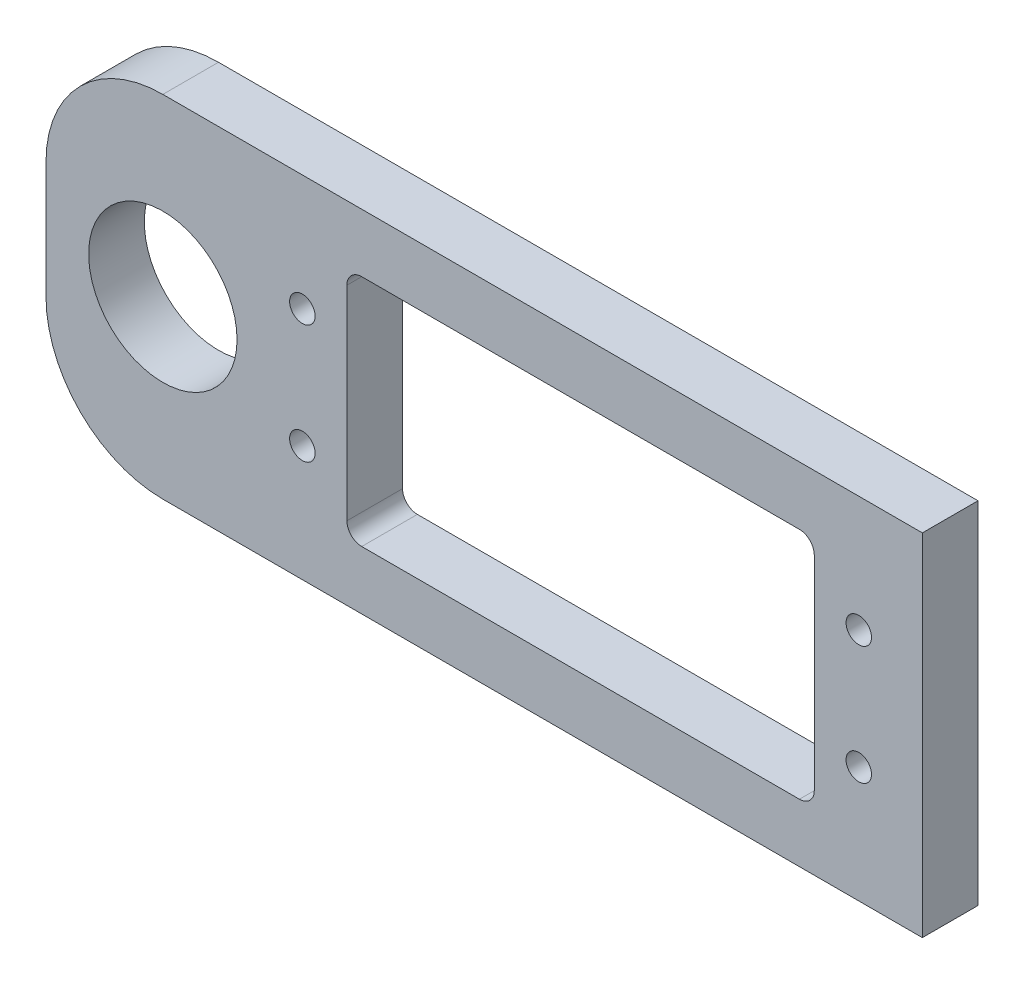
ISO-10303-21;
HEADER;
FILE_DESCRIPTION(('STEP AP214'),'2;1');
FILE_NAME('part.step','',(''),(''),'','','');
FILE_SCHEMA(('AUTOMOTIVE_DESIGN { 1 0 10303 214 1 1 1 1 }'));
ENDSEC;
DATA;
#1=APPLICATION_CONTEXT('core data for automotive mechanical design processes');
#2=APPLICATION_PROTOCOL_DEFINITION('international standard','automotive_design',2000,#1);
#3=PRODUCT_CONTEXT('',#1,'mechanical');
#4=PRODUCT('Part','Part','',(#3));
#5=PRODUCT_RELATED_PRODUCT_CATEGORY('part','',(#4));
#6=PRODUCT_DEFINITION_FORMATION('','',#4);
#7=PRODUCT_DEFINITION_CONTEXT('part definition',#1,'design');
#8=PRODUCT_DEFINITION('design','',#6,#7);
#9=PRODUCT_DEFINITION_SHAPE('','',#8);
#10=(LENGTH_UNIT() NAMED_UNIT(*) SI_UNIT(.MILLI.,.METRE.));
#11=(NAMED_UNIT(*) PLANE_ANGLE_UNIT() SI_UNIT($,.RADIAN.));
#12=(NAMED_UNIT(*) SI_UNIT($,.STERADIAN.) SOLID_ANGLE_UNIT());
#13=UNCERTAINTY_MEASURE_WITH_UNIT(LENGTH_MEASURE(1.E-05),#10,'distance_accuracy_value','');
#14=(GEOMETRIC_REPRESENTATION_CONTEXT(3) GLOBAL_UNCERTAINTY_ASSIGNED_CONTEXT((#13)) GLOBAL_UNIT_ASSIGNED_CONTEXT((#10,
#11,#12)) REPRESENTATION_CONTEXT('',''));
#15=CARTESIAN_POINT('',(0.,0.,0.));
#16=DIRECTION('',(0.,0.,1.));
#17=DIRECTION('',(1.,0.,0.));
#18=AXIS2_PLACEMENT_3D('',#15,#16,#17);
#19=CARTESIAN_POINT('',(37.5,15.,4.7625));
#20=DIRECTION('',(-1.,0.,0.));
#21=DIRECTION('',(0.,-1.,0.));
#22=AXIS2_PLACEMENT_3D('',#19,#20,#21);
#23=PLANE('',#22);
#24=DIRECTION('',(0.,1.,0.));
#25=VECTOR('',#24,1.);
#26=CARTESIAN_POINT('',(37.5,15.,0.));
#27=LINE('',#26,#25);
#28=CARTESIAN_POINT('',(37.5,-15.,0.));
#29=VERTEX_POINT('',#28);
#30=CARTESIAN_POINT('',(37.5,15.,0.));
#31=VERTEX_POINT('',#30);
#32=EDGE_CURVE('E159',#29,#31,#27,.T.);
#33=ORIENTED_EDGE('',*,*,#32,.T.);
#34=DIRECTION('',(0.,0.,-1.));
#35=VECTOR('',#34,1.);
#36=CARTESIAN_POINT('',(37.5,15.,4.7625));
#37=LINE('',#36,#35);
#38=CARTESIAN_POINT('',(37.5,15.,4.7625));
#39=VERTEX_POINT('',#38);
#40=EDGE_CURVE('E139',#39,#31,#37,.T.);
#41=ORIENTED_EDGE('',*,*,#40,.F.);
#42=DIRECTION('',(0.,1.,0.));
#43=VECTOR('',#42,1.);
#44=CARTESIAN_POINT('',(37.5,15.,4.7625));
#45=LINE('',#44,#43);
#46=CARTESIAN_POINT('',(37.5,-15.,4.7625));
#47=VERTEX_POINT('',#46);
#48=EDGE_CURVE('E146',#47,#39,#45,.T.);
#49=ORIENTED_EDGE('',*,*,#48,.F.);
#50=DIRECTION('',(0.,0.,-1.));
#51=VECTOR('',#50,1.);
#52=CARTESIAN_POINT('',(37.5,-15.,4.7625));
#53=LINE('',#52,#51);
#54=EDGE_CURVE('E161',#47,#29,#53,.T.);
#55=ORIENTED_EDGE('',*,*,#54,.T.);
#56=EDGE_LOOP('',(#33,#41,#49,#55));
#57=FACE_BOUND('',#56,.T.);
#58=ADVANCED_FACE('F33',(#57),#23,.F.);
#59=CARTESIAN_POINT('',(-37.5,15.,4.7625));
#60=DIRECTION('',(0.,-1.,0.));
#61=DIRECTION('',(0.,0.,-1.));
#62=AXIS2_PLACEMENT_3D('',#59,#60,#61);
#63=PLANE('',#62);
#64=DIRECTION('',(-1.,0.,0.));
#65=VECTOR('',#64,1.);
#66=CARTESIAN_POINT('',(-37.5,15.,0.));
#67=LINE('',#66,#65);
#68=CARTESIAN_POINT('',(-27.5,15.,0.));
#69=VERTEX_POINT('',#68);
#70=EDGE_CURVE('E304',#31,#69,#67,.T.);
#71=ORIENTED_EDGE('',*,*,#70,.T.);
#72=DIRECTION('',(0.,0.,-1.));
#73=VECTOR('',#72,1.);
#74=CARTESIAN_POINT('',(-27.5,15.,4.7625));
#75=LINE('',#74,#73);
#76=CARTESIAN_POINT('',(-27.5,15.,4.7625));
#77=VERTEX_POINT('',#76);
#78=EDGE_CURVE('E142',#69,#77,#75,.F.);
#79=ORIENTED_EDGE('',*,*,#78,.T.);
#80=DIRECTION('',(-1.,0.,0.));
#81=VECTOR('',#80,1.);
#82=CARTESIAN_POINT('',(-37.5,15.,4.7625));
#83=LINE('',#82,#81);
#84=EDGE_CURVE('E134',#39,#77,#83,.T.);
#85=ORIENTED_EDGE('',*,*,#84,.F.);
#86=ORIENTED_EDGE('',*,*,#40,.T.);
#87=EDGE_LOOP('',(#71,#79,#85,#86));
#88=FACE_BOUND('',#87,.T.);
#89=ADVANCED_FACE('F137',(#88),#63,.F.);
#90=CARTESIAN_POINT('',(-37.5,15.,4.7625));
#91=DIRECTION('',(1.,0.,0.));
#92=DIRECTION('',(0.,1.,0.));
#93=AXIS2_PLACEMENT_3D('',#90,#91,#92);
#94=PLANE('',#93);
#95=DIRECTION('',(0.,-1.,0.));
#96=VECTOR('',#95,1.);
#97=CARTESIAN_POINT('',(-37.5,15.,0.));
#98=LINE('',#97,#96);
#99=CARTESIAN_POINT('',(-37.5,5.,0.));
#100=VERTEX_POINT('',#99);
#101=CARTESIAN_POINT('',(-37.5,-5.,0.));
#102=VERTEX_POINT('',#101);
#103=EDGE_CURVE('E306',#100,#102,#98,.T.);
#104=ORIENTED_EDGE('',*,*,#103,.T.);
#105=DIRECTION('',(0.,0.,-1.));
#106=VECTOR('',#105,1.);
#107=CARTESIAN_POINT('',(-37.5,-5.,4.7625));
#108=LINE('',#107,#106);
#109=CARTESIAN_POINT('',(-37.5,-5.,4.7625));
#110=VERTEX_POINT('',#109);
#111=EDGE_CURVE('E175',#102,#110,#108,.F.);
#112=ORIENTED_EDGE('',*,*,#111,.T.);
#113=DIRECTION('',(0.,-1.,0.));
#114=VECTOR('',#113,1.);
#115=CARTESIAN_POINT('',(-37.5,15.,4.7625));
#116=LINE('',#115,#114);
#117=CARTESIAN_POINT('',(-37.5,5.,4.7625));
#118=VERTEX_POINT('',#117);
#119=EDGE_CURVE('E145',#118,#110,#116,.T.);
#120=ORIENTED_EDGE('',*,*,#119,.F.);
#121=DIRECTION('',(0.,0.,-1.));
#122=VECTOR('',#121,1.);
#123=CARTESIAN_POINT('',(-37.5,5.,4.7625));
#124=LINE('',#123,#122);
#125=EDGE_CURVE('E172',#118,#100,#124,.T.);
#126=ORIENTED_EDGE('',*,*,#125,.T.);
#127=EDGE_LOOP('',(#104,#112,#120,#126));
#128=FACE_BOUND('',#127,.T.);
#129=ADVANCED_FACE('F248',(#128),#94,.F.);
#130=CARTESIAN_POINT('',(-37.5,-15.,4.7625));
#131=DIRECTION('',(0.,1.,0.));
#132=DIRECTION('',(0.,0.,1.));
#133=AXIS2_PLACEMENT_3D('',#130,#131,#132);
#134=PLANE('',#133);
#135=DIRECTION('',(1.,0.,0.));
#136=VECTOR('',#135,1.);
#137=CARTESIAN_POINT('',(-37.5,-15.,4.7625));
#138=LINE('',#137,#136);
#139=CARTESIAN_POINT('',(-27.5,-15.,4.7625));
#140=VERTEX_POINT('',#139);
#141=EDGE_CURVE('E152',#140,#47,#138,.T.);
#142=ORIENTED_EDGE('',*,*,#141,.F.);
#143=DIRECTION('',(0.,0.,-1.));
#144=VECTOR('',#143,1.);
#145=CARTESIAN_POINT('',(-27.5,-15.,4.7625));
#146=LINE('',#145,#144);
#147=CARTESIAN_POINT('',(-27.5,-15.,0.));
#148=VERTEX_POINT('',#147);
#149=EDGE_CURVE('E160',#140,#148,#146,.T.);
#150=ORIENTED_EDGE('',*,*,#149,.T.);
#151=DIRECTION('',(1.,0.,0.));
#152=VECTOR('',#151,1.);
#153=CARTESIAN_POINT('',(-37.5,-15.,0.));
#154=LINE('',#153,#152);
#155=EDGE_CURVE('E156',#148,#29,#154,.T.);
#156=ORIENTED_EDGE('',*,*,#155,.T.);
#157=ORIENTED_EDGE('',*,*,#54,.F.);
#158=EDGE_LOOP('',(#142,#150,#156,#157));
#159=FACE_BOUND('',#158,.T.);
#160=ADVANCED_FACE('F310',(#159),#134,.F.);
#161=CARTESIAN_POINT('',(0.,0.,4.7625));
#162=DIRECTION('',(0.,0.,1.));
#163=DIRECTION('',(1.,0.,0.));
#164=AXIS2_PLACEMENT_3D('',#161,#162,#163);
#165=PLANE('',#164);
#166=CARTESIAN_POINT('',(32.06,5.08000000000001,4.7625));
#167=DIRECTION('',(0.,0.,1.));
#168=DIRECTION('',(-1.,0.,0.));
#169=AXIS2_PLACEMENT_3D('',#166,#167,#168);
#170=CIRCLE('',#169,1.09);
#171=CARTESIAN_POINT('',(30.97,5.08000000000001,4.7625));
#172=VERTEX_POINT('',#171);
#173=EDGE_CURVE('E377',#172,#172,#170,.T.);
#174=ORIENTED_EDGE('',*,*,#173,.F.);
#175=EDGE_LOOP('',(#174));
#176=FACE_BOUND('',#175,.T.);
#177=CARTESIAN_POINT('',(32.06,-5.07999999999999,4.7625));
#178=DIRECTION('',(0.,0.,1.));
#179=DIRECTION('',(1.,0.,0.));
#180=AXIS2_PLACEMENT_3D('',#177,#178,#179);
#181=CIRCLE('',#180,1.09);
#182=CARTESIAN_POINT('',(33.15,-5.07999999999999,4.7625));
#183=VERTEX_POINT('',#182);
#184=EDGE_CURVE('E371',#183,#183,#181,.T.);
#185=ORIENTED_EDGE('',*,*,#184,.F.);
#186=EDGE_LOOP('',(#185));
#187=FACE_BOUND('',#186,.T.);
#188=CARTESIAN_POINT('',(-15.56,-5.08,4.7625));
#189=DIRECTION('',(0.,0.,1.));
#190=DIRECTION('',(-1.,0.,0.));
#191=AXIS2_PLACEMENT_3D('',#188,#189,#190);
#192=CIRCLE('',#191,1.09);
#193=CARTESIAN_POINT('',(-16.65,-5.08,4.7625));
#194=VERTEX_POINT('',#193);
#195=EDGE_CURVE('E361',#194,#194,#192,.T.);
#196=ORIENTED_EDGE('',*,*,#195,.F.);
#197=EDGE_LOOP('',(#196));
#198=FACE_BOUND('',#197,.T.);
#199=CARTESIAN_POINT('',(-15.56,5.08,4.7625));
#200=DIRECTION('',(0.,0.,1.));
#201=DIRECTION('',(1.,0.,0.));
#202=AXIS2_PLACEMENT_3D('',#199,#200,#201);
#203=CIRCLE('',#202,1.09);
#204=CARTESIAN_POINT('',(-14.47,5.08,4.7625));
#205=VERTEX_POINT('',#204);
#206=EDGE_CURVE('E282',#205,#205,#203,.T.);
#207=ORIENTED_EDGE('',*,*,#206,.F.);
#208=EDGE_LOOP('',(#207));
#209=FACE_BOUND('',#208,.T.);
#210=DIRECTION('',(0.,-1.,0.));
#211=VECTOR('',#210,1.);
#212=CARTESIAN_POINT('',(-11.75,10.,4.7625));
#213=LINE('',#212,#211);
#214=CARTESIAN_POINT('',(-11.75,8.73,4.7625));
#215=VERTEX_POINT('',#214);
#216=CARTESIAN_POINT('',(-11.75,-8.73,4.7625));
#217=VERTEX_POINT('',#216);
#218=EDGE_CURVE('E288',#215,#217,#213,.T.);
#219=ORIENTED_EDGE('',*,*,#218,.F.);
#220=CARTESIAN_POINT('',(-10.48,8.73,4.7625));
#221=DIRECTION('',(0.,0.,1.));
#222=DIRECTION('',(1.,0.,0.));
#223=AXIS2_PLACEMENT_3D('',#220,#221,#222);
#224=CIRCLE('',#223,1.27);
#225=CARTESIAN_POINT('',(-10.48,10.,4.7625));
#226=VERTEX_POINT('',#225);
#227=EDGE_CURVE('E41',#215,#226,#224,.F.);
#228=ORIENTED_EDGE('',*,*,#227,.T.);
#229=DIRECTION('',(-1.,0.,0.));
#230=VECTOR('',#229,1.);
#231=CARTESIAN_POINT('',(-11.75,10.,4.7625));
#232=LINE('',#231,#230);
#233=CARTESIAN_POINT('',(26.98,10.,4.7625));
#234=VERTEX_POINT('',#233);
#235=EDGE_CURVE('E296',#234,#226,#232,.T.);
#236=ORIENTED_EDGE('',*,*,#235,.F.);
#237=CARTESIAN_POINT('',(26.98,8.73,4.7625));
#238=DIRECTION('',(0.,0.,1.));
#239=DIRECTION('',(1.,0.,0.));
#240=AXIS2_PLACEMENT_3D('',#237,#238,#239);
#241=CIRCLE('',#240,1.27);
#242=CARTESIAN_POINT('',(28.25,8.73,4.7625));
#243=VERTEX_POINT('',#242);
#244=EDGE_CURVE('E55',#234,#243,#241,.F.);
#245=ORIENTED_EDGE('',*,*,#244,.T.);
#246=DIRECTION('',(0.,1.,0.));
#247=VECTOR('',#246,1.);
#248=CARTESIAN_POINT('',(28.25,10.,4.7625));
#249=LINE('',#248,#247);
#250=CARTESIAN_POINT('',(28.25,-8.73,4.7625));
#251=VERTEX_POINT('',#250);
#252=EDGE_CURVE('E294',#251,#243,#249,.T.);
#253=ORIENTED_EDGE('',*,*,#252,.F.);
#254=CARTESIAN_POINT('',(26.98,-8.73,4.7625));
#255=DIRECTION('',(0.,0.,1.));
#256=DIRECTION('',(1.,0.,0.));
#257=AXIS2_PLACEMENT_3D('',#254,#255,#256);
#258=CIRCLE('',#257,1.27);
#259=CARTESIAN_POINT('',(26.98,-10.,4.7625));
#260=VERTEX_POINT('',#259);
#261=EDGE_CURVE('E205',#251,#260,#258,.F.);
#262=ORIENTED_EDGE('',*,*,#261,.T.);
#263=DIRECTION('',(1.,0.,0.));
#264=VECTOR('',#263,1.);
#265=CARTESIAN_POINT('',(-11.75,-10.,4.7625));
#266=LINE('',#265,#264);
#267=CARTESIAN_POINT('',(-10.48,-10.,4.7625));
#268=VERTEX_POINT('',#267);
#269=EDGE_CURVE('E291',#268,#260,#266,.T.);
#270=ORIENTED_EDGE('',*,*,#269,.F.);
#271=CARTESIAN_POINT('',(-10.48,-8.73,4.7625));
#272=DIRECTION('',(0.,0.,1.));
#273=DIRECTION('',(1.,0.,0.));
#274=AXIS2_PLACEMENT_3D('',#271,#272,#273);
#275=CIRCLE('',#274,1.27);
#276=EDGE_CURVE('E209',#268,#217,#275,.F.);
#277=ORIENTED_EDGE('',*,*,#276,.T.);
#278=EDGE_LOOP('',(#219,#228,#236,#245,#253,#262,#270,#277));
#279=FACE_BOUND('',#278,.T.);
#280=CARTESIAN_POINT('',(-27.5,0.,4.7625));
#281=DIRECTION('',(0.,0.,1.));
#282=DIRECTION('',(1.,0.,0.));
#283=AXIS2_PLACEMENT_3D('',#280,#281,#282);
#284=CIRCLE('',#283,6.35);
#285=CARTESIAN_POINT('',(-21.15,0.,4.7625));
#286=VERTEX_POINT('',#285);
#287=EDGE_CURVE('E186',#286,#286,#284,.T.);
#288=ORIENTED_EDGE('',*,*,#287,.F.);
#289=EDGE_LOOP('',(#288));
#290=FACE_BOUND('',#289,.T.);
#291=ORIENTED_EDGE('',*,*,#119,.T.);
#292=CARTESIAN_POINT('',(-27.5,-5.,4.7625));
#293=DIRECTION('',(0.,0.,1.));
#294=DIRECTION('',(1.,0.,0.));
#295=AXIS2_PLACEMENT_3D('',#292,#293,#294);
#296=CIRCLE('',#295,10.);
#297=EDGE_CURVE('E179',#110,#140,#296,.T.);
#298=ORIENTED_EDGE('',*,*,#297,.T.);
#299=ORIENTED_EDGE('',*,*,#141,.T.);
#300=ORIENTED_EDGE('',*,*,#48,.T.);
#301=ORIENTED_EDGE('',*,*,#84,.T.);
#302=CARTESIAN_POINT('',(-27.5,5.,4.7625));
#303=DIRECTION('',(0.,0.,1.));
#304=DIRECTION('',(1.,0.,0.));
#305=AXIS2_PLACEMENT_3D('',#302,#303,#304);
#306=CIRCLE('',#305,10.);
#307=EDGE_CURVE('E177',#77,#118,#306,.T.);
#308=ORIENTED_EDGE('',*,*,#307,.T.);
#309=EDGE_LOOP('',(#291,#298,#299,#300,#301,#308));
#310=FACE_BOUND('',#309,.T.);
#311=ADVANCED_FACE('F150',(#176,#187,#198,#209,#279,#290,#310),#165,.T.);
#312=CARTESIAN_POINT('',(0.,0.,0.));
#313=DIRECTION('',(0.,0.,1.));
#314=DIRECTION('',(1.,0.,0.));
#315=AXIS2_PLACEMENT_3D('',#312,#313,#314);
#316=PLANE('',#315);
#317=CARTESIAN_POINT('',(32.06,5.08000000000001,0.));
#318=DIRECTION('',(0.,0.,1.));
#319=DIRECTION('',(1.,0.,0.));
#320=AXIS2_PLACEMENT_3D('',#317,#318,#319);
#321=CIRCLE('',#320,1.09);
#322=CARTESIAN_POINT('',(33.15,5.08000000000001,0.));
#323=VERTEX_POINT('',#322);
#324=EDGE_CURVE('E374',#323,#323,#321,.F.);
#325=ORIENTED_EDGE('',*,*,#324,.F.);
#326=EDGE_LOOP('',(#325));
#327=FACE_BOUND('',#326,.T.);
#328=CARTESIAN_POINT('',(32.06,-5.07999999999999,0.));
#329=DIRECTION('',(0.,0.,1.));
#330=DIRECTION('',(1.,0.,0.));
#331=AXIS2_PLACEMENT_3D('',#328,#329,#330);
#332=CIRCLE('',#331,1.09);
#333=CARTESIAN_POINT('',(33.15,-5.07999999999999,0.));
#334=VERTEX_POINT('',#333);
#335=EDGE_CURVE('E368',#334,#334,#332,.F.);
#336=ORIENTED_EDGE('',*,*,#335,.F.);
#337=EDGE_LOOP('',(#336));
#338=FACE_BOUND('',#337,.T.);
#339=CARTESIAN_POINT('',(-15.56,-5.08,0.));
#340=DIRECTION('',(0.,0.,1.));
#341=DIRECTION('',(1.,0.,0.));
#342=AXIS2_PLACEMENT_3D('',#339,#340,#341);
#343=CIRCLE('',#342,1.09);
#344=CARTESIAN_POINT('',(-14.47,-5.08,0.));
#345=VERTEX_POINT('',#344);
#346=EDGE_CURVE('E364',#345,#345,#343,.F.);
#347=ORIENTED_EDGE('',*,*,#346,.F.);
#348=EDGE_LOOP('',(#347));
#349=FACE_BOUND('',#348,.T.);
#350=CARTESIAN_POINT('',(-15.56,5.08,0.));
#351=DIRECTION('',(0.,0.,1.));
#352=DIRECTION('',(1.,0.,0.));
#353=AXIS2_PLACEMENT_3D('',#350,#351,#352);
#354=CIRCLE('',#353,1.09);
#355=CARTESIAN_POINT('',(-14.47,5.08,0.));
#356=VERTEX_POINT('',#355);
#357=EDGE_CURVE('E279',#356,#356,#354,.F.);
#358=ORIENTED_EDGE('',*,*,#357,.F.);
#359=EDGE_LOOP('',(#358));
#360=FACE_BOUND('',#359,.T.);
#361=DIRECTION('',(1.,0.,0.));
#362=VECTOR('',#361,1.);
#363=CARTESIAN_POINT('',(-11.75,10.,0.));
#364=LINE('',#363,#362);
#365=CARTESIAN_POINT('',(-10.48,10.,0.));
#366=VERTEX_POINT('',#365);
#367=CARTESIAN_POINT('',(26.98,10.,0.));
#368=VERTEX_POINT('',#367);
#369=EDGE_CURVE('E222',#366,#368,#364,.T.);
#370=ORIENTED_EDGE('',*,*,#369,.F.);
#371=CARTESIAN_POINT('',(-10.48,8.73,0.));
#372=DIRECTION('',(0.,0.,1.));
#373=DIRECTION('',(1.,0.,0.));
#374=AXIS2_PLACEMENT_3D('',#371,#372,#373);
#375=CIRCLE('',#374,1.27);
#376=CARTESIAN_POINT('',(-11.75,8.73,0.));
#377=VERTEX_POINT('',#376);
#378=EDGE_CURVE('E11',#366,#377,#375,.T.);
#379=ORIENTED_EDGE('',*,*,#378,.T.);
#380=DIRECTION('',(0.,1.,0.));
#381=VECTOR('',#380,1.);
#382=CARTESIAN_POINT('',(-11.75,10.,0.));
#383=LINE('',#382,#381);
#384=CARTESIAN_POINT('',(-11.75,-8.73,0.));
#385=VERTEX_POINT('',#384);
#386=EDGE_CURVE('E229',#385,#377,#383,.T.);
#387=ORIENTED_EDGE('',*,*,#386,.F.);
#388=CARTESIAN_POINT('',(-10.48,-8.73,0.));
#389=DIRECTION('',(0.,0.,1.));
#390=DIRECTION('',(1.,0.,0.));
#391=AXIS2_PLACEMENT_3D('',#388,#389,#390);
#392=CIRCLE('',#391,1.27);
#393=CARTESIAN_POINT('',(-10.48,-10.,0.));
#394=VERTEX_POINT('',#393);
#395=EDGE_CURVE('E211',#385,#394,#392,.T.);
#396=ORIENTED_EDGE('',*,*,#395,.T.);
#397=DIRECTION('',(-1.,0.,0.));
#398=VECTOR('',#397,1.);
#399=CARTESIAN_POINT('',(-11.75,-10.,0.));
#400=LINE('',#399,#398);
#401=CARTESIAN_POINT('',(26.98,-10.,0.));
#402=VERTEX_POINT('',#401);
#403=EDGE_CURVE('E275',#402,#394,#400,.T.);
#404=ORIENTED_EDGE('',*,*,#403,.F.);
#405=CARTESIAN_POINT('',(26.98,-8.73,0.));
#406=DIRECTION('',(0.,0.,1.));
#407=DIRECTION('',(1.,0.,0.));
#408=AXIS2_PLACEMENT_3D('',#405,#406,#407);
#409=CIRCLE('',#408,1.27);
#410=CARTESIAN_POINT('',(28.25,-8.73,0.));
#411=VERTEX_POINT('',#410);
#412=EDGE_CURVE('E207',#402,#411,#409,.T.);
#413=ORIENTED_EDGE('',*,*,#412,.T.);
#414=DIRECTION('',(0.,-1.,0.));
#415=VECTOR('',#414,1.);
#416=CARTESIAN_POINT('',(28.25,10.,0.));
#417=LINE('',#416,#415);
#418=CARTESIAN_POINT('',(28.25,8.73,0.));
#419=VERTEX_POINT('',#418);
#420=EDGE_CURVE('E225',#419,#411,#417,.T.);
#421=ORIENTED_EDGE('',*,*,#420,.F.);
#422=CARTESIAN_POINT('',(26.98,8.73,0.));
#423=DIRECTION('',(0.,0.,1.));
#424=DIRECTION('',(1.,0.,0.));
#425=AXIS2_PLACEMENT_3D('',#422,#423,#424);
#426=CIRCLE('',#425,1.27);
#427=EDGE_CURVE('E214',#419,#368,#426,.T.);
#428=ORIENTED_EDGE('',*,*,#427,.T.);
#429=EDGE_LOOP('',(#370,#379,#387,#396,#404,#413,#421,#428));
#430=FACE_BOUND('',#429,.T.);
#431=CARTESIAN_POINT('',(-27.5,0.,0.));
#432=DIRECTION('',(0.,0.,1.));
#433=DIRECTION('',(1.,0.,0.));
#434=AXIS2_PLACEMENT_3D('',#431,#432,#433);
#435=CIRCLE('',#434,6.35);
#436=CARTESIAN_POINT('',(-21.15,0.,0.));
#437=VERTEX_POINT('',#436);
#438=EDGE_CURVE('E183',#437,#437,#435,.T.);
#439=ORIENTED_EDGE('',*,*,#438,.T.);
#440=EDGE_LOOP('',(#439));
#441=FACE_BOUND('',#440,.T.);
#442=ORIENTED_EDGE('',*,*,#155,.F.);
#443=CARTESIAN_POINT('',(-27.5,-5.,0.));
#444=DIRECTION('',(0.,0.,1.));
#445=DIRECTION('',(1.,0.,0.));
#446=AXIS2_PLACEMENT_3D('',#443,#444,#445);
#447=CIRCLE('',#446,10.);
#448=EDGE_CURVE('E170',#148,#102,#447,.F.);
#449=ORIENTED_EDGE('',*,*,#448,.T.);
#450=ORIENTED_EDGE('',*,*,#103,.F.);
#451=CARTESIAN_POINT('',(-27.5,5.,0.));
#452=DIRECTION('',(0.,0.,1.));
#453=DIRECTION('',(1.,0.,0.));
#454=AXIS2_PLACEMENT_3D('',#451,#452,#453);
#455=CIRCLE('',#454,10.);
#456=EDGE_CURVE('E164',#100,#69,#455,.F.);
#457=ORIENTED_EDGE('',*,*,#456,.T.);
#458=ORIENTED_EDGE('',*,*,#70,.F.);
#459=ORIENTED_EDGE('',*,*,#32,.F.);
#460=EDGE_LOOP('',(#442,#449,#450,#457,#458,#459));
#461=FACE_BOUND('',#460,.T.);
#462=ADVANCED_FACE('F220',(#327,#338,#349,#360,#430,#441,#461),#316,.F.);
#463=CARTESIAN_POINT('',(-27.5,-5.,4.7625));
#464=DIRECTION('',(0.,0.,-1.));
#465=DIRECTION('',(-1.,0.,0.));
#466=AXIS2_PLACEMENT_3D('',#463,#464,#465);
#467=CYLINDRICAL_SURFACE('',#466,10.);
#468=ORIENTED_EDGE('',*,*,#297,.F.);
#469=ORIENTED_EDGE('',*,*,#111,.F.);
#470=ORIENTED_EDGE('',*,*,#448,.F.);
#471=ORIENTED_EDGE('',*,*,#149,.F.);
#472=EDGE_LOOP('',(#468,#469,#470,#471));
#473=FACE_BOUND('',#472,.T.);
#474=ADVANCED_FACE('F252',(#473),#467,.T.);
#475=CARTESIAN_POINT('',(-27.5,5.,4.7625));
#476=DIRECTION('',(0.,0.,-1.));
#477=DIRECTION('',(-1.,0.,0.));
#478=AXIS2_PLACEMENT_3D('',#475,#476,#477);
#479=CYLINDRICAL_SURFACE('',#478,10.);
#480=ORIENTED_EDGE('',*,*,#307,.F.);
#481=ORIENTED_EDGE('',*,*,#78,.F.);
#482=ORIENTED_EDGE('',*,*,#456,.F.);
#483=ORIENTED_EDGE('',*,*,#125,.F.);
#484=EDGE_LOOP('',(#480,#481,#482,#483));
#485=FACE_BOUND('',#484,.T.);
#486=ADVANCED_FACE('F255',(#485),#479,.T.);
#487=CARTESIAN_POINT('',(-27.5,0.,-1.2375));
#488=DIRECTION('',(0.,0.,1.));
#489=DIRECTION('',(1.,0.,0.));
#490=AXIS2_PLACEMENT_3D('',#487,#488,#489);
#491=CYLINDRICAL_SURFACE('',#490,6.35);
#492=ORIENTED_EDGE('',*,*,#287,.T.);
#493=EDGE_LOOP('',(#492));
#494=FACE_BOUND('',#493,.T.);
#495=ORIENTED_EDGE('',*,*,#438,.F.);
#496=EDGE_LOOP('',(#495));
#497=FACE_BOUND('',#496,.T.);
#498=ADVANCED_FACE('F259',(#494,#497),#491,.F.);
#499=CARTESIAN_POINT('',(-11.75,10.,-0.00100000000000013));
#500=DIRECTION('',(-1.,0.,0.));
#501=DIRECTION('',(0.,-1.,0.));
#502=AXIS2_PLACEMENT_3D('',#499,#500,#501);
#503=PLANE('',#502);
#504=ORIENTED_EDGE('',*,*,#218,.T.);
#505=DIRECTION('',(0.,0.,1.));
#506=VECTOR('',#505,1.);
#507=CARTESIAN_POINT('',(-11.75,-8.73,0.));
#508=LINE('',#507,#506);
#509=EDGE_CURVE('E199',#217,#385,#508,.F.);
#510=ORIENTED_EDGE('',*,*,#509,.T.);
#511=ORIENTED_EDGE('',*,*,#386,.T.);
#512=DIRECTION('',(0.,0.,1.));
#513=VECTOR('',#512,1.);
#514=CARTESIAN_POINT('',(-11.75,8.73,4.7625));
#515=LINE('',#514,#513);
#516=EDGE_CURVE('E196',#377,#215,#515,.T.);
#517=ORIENTED_EDGE('',*,*,#516,.T.);
#518=EDGE_LOOP('',(#504,#510,#511,#517));
#519=FACE_BOUND('',#518,.T.);
#520=ADVANCED_FACE('F333',(#519),#503,.F.);
#521=CARTESIAN_POINT('',(-11.75,10.,-0.00100000000000013));
#522=DIRECTION('',(0.,1.,0.));
#523=DIRECTION('',(0.,0.,1.));
#524=AXIS2_PLACEMENT_3D('',#521,#522,#523);
#525=PLANE('',#524);
#526=ORIENTED_EDGE('',*,*,#369,.T.);
#527=DIRECTION('',(0.,0.,1.));
#528=VECTOR('',#527,1.);
#529=CARTESIAN_POINT('',(26.98,10.,4.7625));
#530=LINE('',#529,#528);
#531=EDGE_CURVE('E203',#368,#234,#530,.T.);
#532=ORIENTED_EDGE('',*,*,#531,.T.);
#533=ORIENTED_EDGE('',*,*,#235,.T.);
#534=DIRECTION('',(0.,0.,1.));
#535=VECTOR('',#534,1.);
#536=CARTESIAN_POINT('',(-10.48,10.,0.));
#537=LINE('',#536,#535);
#538=EDGE_CURVE('E201',#226,#366,#537,.F.);
#539=ORIENTED_EDGE('',*,*,#538,.T.);
#540=EDGE_LOOP('',(#526,#532,#533,#539));
#541=FACE_BOUND('',#540,.T.);
#542=ADVANCED_FACE('F227',(#541),#525,.F.);
#543=CARTESIAN_POINT('',(28.25,10.,-0.00100000000000013));
#544=DIRECTION('',(1.,0.,0.));
#545=DIRECTION('',(0.,1.,0.));
#546=AXIS2_PLACEMENT_3D('',#543,#544,#545);
#547=PLANE('',#546);
#548=ORIENTED_EDGE('',*,*,#420,.T.);
#549=DIRECTION('',(0.,0.,1.));
#550=VECTOR('',#549,1.);
#551=CARTESIAN_POINT('',(28.25,-8.73,4.7625));
#552=LINE('',#551,#550);
#553=EDGE_CURVE('E188',#411,#251,#552,.T.);
#554=ORIENTED_EDGE('',*,*,#553,.T.);
#555=ORIENTED_EDGE('',*,*,#252,.T.);
#556=DIRECTION('',(0.,0.,1.));
#557=VECTOR('',#556,1.);
#558=CARTESIAN_POINT('',(28.25,8.73,0.));
#559=LINE('',#558,#557);
#560=EDGE_CURVE('E182',#243,#419,#559,.F.);
#561=ORIENTED_EDGE('',*,*,#560,.T.);
#562=EDGE_LOOP('',(#548,#554,#555,#561));
#563=FACE_BOUND('',#562,.T.);
#564=ADVANCED_FACE('F267',(#563),#547,.F.);
#565=CARTESIAN_POINT('',(-11.75,-10.,-0.00100000000000013));
#566=DIRECTION('',(0.,-1.,0.));
#567=DIRECTION('',(0.,0.,-1.));
#568=AXIS2_PLACEMENT_3D('',#565,#566,#567);
#569=PLANE('',#568);
#570=ORIENTED_EDGE('',*,*,#269,.T.);
#571=DIRECTION('',(0.,0.,1.));
#572=VECTOR('',#571,1.);
#573=CARTESIAN_POINT('',(26.98,-10.,0.));
#574=LINE('',#573,#572);
#575=EDGE_CURVE('E194',#260,#402,#574,.F.);
#576=ORIENTED_EDGE('',*,*,#575,.T.);
#577=ORIENTED_EDGE('',*,*,#403,.T.);
#578=DIRECTION('',(0.,0.,1.));
#579=VECTOR('',#578,1.);
#580=CARTESIAN_POINT('',(-10.48,-10.,4.7625));
#581=LINE('',#580,#579);
#582=EDGE_CURVE('E191',#394,#268,#581,.T.);
#583=ORIENTED_EDGE('',*,*,#582,.T.);
#584=EDGE_LOOP('',(#570,#576,#577,#583));
#585=FACE_BOUND('',#584,.T.);
#586=ADVANCED_FACE('F262',(#585),#569,.F.);
#587=CARTESIAN_POINT('',(26.98,-8.73,-0.00100000000000013));
#588=DIRECTION('',(0.,0.,-1.));
#589=DIRECTION('',(-1.,0.,0.));
#590=AXIS2_PLACEMENT_3D('',#587,#588,#589);
#591=CYLINDRICAL_SURFACE('',#590,1.27);
#592=ORIENTED_EDGE('',*,*,#412,.F.);
#593=ORIENTED_EDGE('',*,*,#575,.F.);
#594=ORIENTED_EDGE('',*,*,#261,.F.);
#595=ORIENTED_EDGE('',*,*,#553,.F.);
#596=EDGE_LOOP('',(#592,#593,#594,#595));
#597=FACE_BOUND('',#596,.T.);
#598=ADVANCED_FACE('F240',(#597),#591,.F.);
#599=CARTESIAN_POINT('',(-10.48,-8.73,-0.00100000000000013));
#600=DIRECTION('',(0.,0.,-1.));
#601=DIRECTION('',(-1.,0.,0.));
#602=AXIS2_PLACEMENT_3D('',#599,#600,#601);
#603=CYLINDRICAL_SURFACE('',#602,1.27);
#604=ORIENTED_EDGE('',*,*,#395,.F.);
#605=ORIENTED_EDGE('',*,*,#509,.F.);
#606=ORIENTED_EDGE('',*,*,#276,.F.);
#607=ORIENTED_EDGE('',*,*,#582,.F.);
#608=EDGE_LOOP('',(#604,#605,#606,#607));
#609=FACE_BOUND('',#608,.T.);
#610=ADVANCED_FACE('F233',(#609),#603,.F.);
#611=CARTESIAN_POINT('',(26.98,8.73,-0.00100000000000013));
#612=DIRECTION('',(0.,0.,-1.));
#613=DIRECTION('',(-1.,0.,0.));
#614=AXIS2_PLACEMENT_3D('',#611,#612,#613);
#615=CYLINDRICAL_SURFACE('',#614,1.27);
#616=ORIENTED_EDGE('',*,*,#427,.F.);
#617=ORIENTED_EDGE('',*,*,#560,.F.);
#618=ORIENTED_EDGE('',*,*,#244,.F.);
#619=ORIENTED_EDGE('',*,*,#531,.F.);
#620=EDGE_LOOP('',(#616,#617,#618,#619));
#621=FACE_BOUND('',#620,.T.);
#622=ADVANCED_FACE('F231',(#621),#615,.F.);
#623=CARTESIAN_POINT('',(-10.48,8.73,-0.00100000000000013));
#624=DIRECTION('',(0.,0.,-1.));
#625=DIRECTION('',(-1.,0.,0.));
#626=AXIS2_PLACEMENT_3D('',#623,#624,#625);
#627=CYLINDRICAL_SURFACE('',#626,1.27);
#628=ORIENTED_EDGE('',*,*,#378,.F.);
#629=ORIENTED_EDGE('',*,*,#538,.F.);
#630=ORIENTED_EDGE('',*,*,#227,.F.);
#631=ORIENTED_EDGE('',*,*,#516,.F.);
#632=EDGE_LOOP('',(#628,#629,#630,#631));
#633=FACE_BOUND('',#632,.T.);
#634=ADVANCED_FACE('F35',(#633),#627,.F.);
#635=CARTESIAN_POINT('',(-15.56,5.08,-0.00100000000000013));
#636=DIRECTION('',(0.,0.,1.));
#637=DIRECTION('',(1.,0.,0.));
#638=AXIS2_PLACEMENT_3D('',#635,#636,#637);
#639=CYLINDRICAL_SURFACE('',#638,1.09);
#640=ORIENTED_EDGE('',*,*,#206,.T.);
#641=EDGE_LOOP('',(#640));
#642=FACE_BOUND('',#641,.T.);
#643=ORIENTED_EDGE('',*,*,#357,.T.);
#644=EDGE_LOOP('',(#643));
#645=FACE_BOUND('',#644,.T.);
#646=ADVANCED_FACE('F238',(#642,#645),#639,.F.);
#647=CARTESIAN_POINT('',(-15.56,-5.08,-0.00100000000000013));
#648=DIRECTION('',(0.,0.,1.));
#649=DIRECTION('',(1.,0.,0.));
#650=AXIS2_PLACEMENT_3D('',#647,#648,#649);
#651=CYLINDRICAL_SURFACE('',#650,1.09);
#652=ORIENTED_EDGE('',*,*,#195,.T.);
#653=EDGE_LOOP('',(#652));
#654=FACE_BOUND('',#653,.T.);
#655=ORIENTED_EDGE('',*,*,#346,.T.);
#656=EDGE_LOOP('',(#655));
#657=FACE_BOUND('',#656,.T.);
#658=ADVANCED_FACE('F344',(#654,#657),#651,.F.);
#659=CARTESIAN_POINT('',(32.06,-5.07999999999999,-0.00100000000000013));
#660=DIRECTION('',(0.,0.,1.));
#661=DIRECTION('',(1.,0.,0.));
#662=AXIS2_PLACEMENT_3D('',#659,#660,#661);
#663=CYLINDRICAL_SURFACE('',#662,1.09);
#664=ORIENTED_EDGE('',*,*,#184,.T.);
#665=EDGE_LOOP('',(#664));
#666=FACE_BOUND('',#665,.T.);
#667=ORIENTED_EDGE('',*,*,#335,.T.);
#668=EDGE_LOOP('',(#667));
#669=FACE_BOUND('',#668,.T.);
#670=ADVANCED_FACE('F349',(#666,#669),#663,.F.);
#671=CARTESIAN_POINT('',(32.06,5.08000000000001,-0.00100000000000013));
#672=DIRECTION('',(0.,0.,1.));
#673=DIRECTION('',(1.,0.,0.));
#674=AXIS2_PLACEMENT_3D('',#671,#672,#673);
#675=CYLINDRICAL_SURFACE('',#674,1.09);
#676=ORIENTED_EDGE('',*,*,#173,.T.);
#677=EDGE_LOOP('',(#676));
#678=FACE_BOUND('',#677,.T.);
#679=ORIENTED_EDGE('',*,*,#324,.T.);
#680=EDGE_LOOP('',(#679));
#681=FACE_BOUND('',#680,.T.);
#682=ADVANCED_FACE('F346',(#678,#681),#675,.F.);
#683=CLOSED_SHELL('',(#58,#89,#129,#160,#311,#462,#474,#486,#498,#520,#542,#564,#586,#598,#610,
#622,#634,#646,#658,#670,#682));
#684=MANIFOLD_SOLID_BREP('B2',#683);
#685=ADVANCED_BREP_SHAPE_REPRESENTATION('',(#18,#684),#14);
#686=SHAPE_DEFINITION_REPRESENTATION(#9,#685);
ENDSEC;
END-ISO-10303-21;
